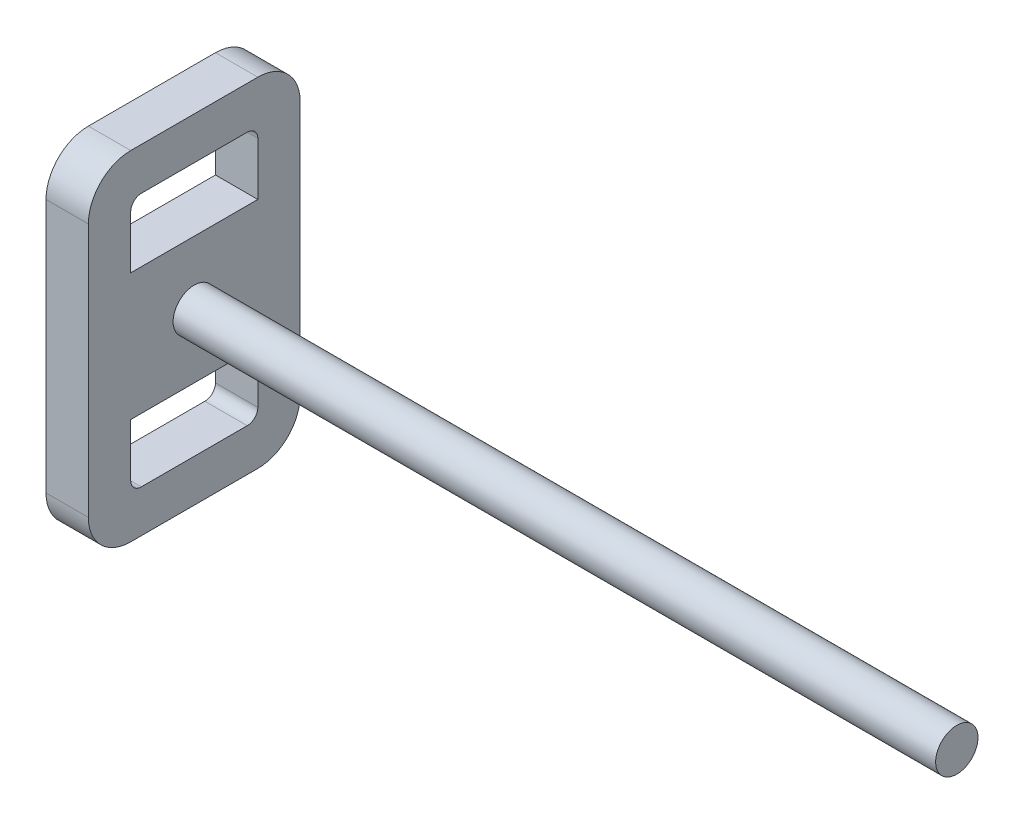
ISO-10303-21;
HEADER;
FILE_DESCRIPTION(('STEP AP214'),'2;1');
FILE_NAME('part.step','',(''),(''),'','','');
FILE_SCHEMA(('AUTOMOTIVE_DESIGN { 1 0 10303 214 1 1 1 1 }'));
ENDSEC;
DATA;
#1=APPLICATION_CONTEXT('core data for automotive mechanical design processes');
#2=APPLICATION_PROTOCOL_DEFINITION('international standard','automotive_design',2000,#1);
#3=PRODUCT_CONTEXT('',#1,'mechanical');
#4=PRODUCT('Part','Part','',(#3));
#5=PRODUCT_RELATED_PRODUCT_CATEGORY('part','',(#4));
#6=PRODUCT_DEFINITION_FORMATION('','',#4);
#7=PRODUCT_DEFINITION_CONTEXT('part definition',#1,'design');
#8=PRODUCT_DEFINITION('design','',#6,#7);
#9=PRODUCT_DEFINITION_SHAPE('','',#8);
#10=(LENGTH_UNIT() NAMED_UNIT(*) SI_UNIT(.MILLI.,.METRE.));
#11=(NAMED_UNIT(*) PLANE_ANGLE_UNIT() SI_UNIT($,.RADIAN.));
#12=(NAMED_UNIT(*) SI_UNIT($,.STERADIAN.) SOLID_ANGLE_UNIT());
#13=UNCERTAINTY_MEASURE_WITH_UNIT(LENGTH_MEASURE(1.E-05),#10,'distance_accuracy_value','');
#14=(GEOMETRIC_REPRESENTATION_CONTEXT(3) GLOBAL_UNCERTAINTY_ASSIGNED_CONTEXT((#13)) GLOBAL_UNIT_ASSIGNED_CONTEXT((#10,
#11,#12)) REPRESENTATION_CONTEXT('',''));
#15=CARTESIAN_POINT('',(0.,0.,0.));
#16=DIRECTION('',(0.,0.,1.));
#17=DIRECTION('',(1.,0.,0.));
#18=AXIS2_PLACEMENT_3D('',#15,#16,#17);
#19=CARTESIAN_POINT('',(457.2,0.,0.));
#20=DIRECTION('',(-1.,0.,0.));
#21=DIRECTION('',(0.,0.,1.));
#22=AXIS2_PLACEMENT_3D('',#19,#20,#21);
#23=CYLINDRICAL_SURFACE('',#22,12.7);
#24=CARTESIAN_POINT('',(457.2,0.,0.));
#25=DIRECTION('',(1.,0.,0.));
#26=DIRECTION('',(0.,0.,-1.));
#27=AXIS2_PLACEMENT_3D('',#24,#25,#26);
#28=CIRCLE('',#27,12.7);
#29=CARTESIAN_POINT('',(457.2,0.,-12.7));
#30=VERTEX_POINT('',#29);
#31=EDGE_CURVE('E11',#30,#30,#28,.T.);
#32=ORIENTED_EDGE('',*,*,#31,.F.);
#33=EDGE_LOOP('',(#32));
#34=FACE_BOUND('',#33,.T.);
#35=CARTESIAN_POINT('',(0.,0.,0.));
#36=DIRECTION('',(1.,0.,0.));
#37=DIRECTION('',(0.,0.,-1.));
#38=AXIS2_PLACEMENT_3D('',#35,#36,#37);
#39=CIRCLE('',#38,12.7);
#40=CARTESIAN_POINT('',(0.,0.,-12.7));
#41=VERTEX_POINT('',#40);
#42=EDGE_CURVE('E47',#41,#41,#39,.T.);
#43=ORIENTED_EDGE('',*,*,#42,.T.);
#44=EDGE_LOOP('',(#43));
#45=FACE_BOUND('',#44,.T.);
#46=ADVANCED_FACE('F39',(#34,#45),#23,.T.);
#47=CARTESIAN_POINT('',(457.2,0.,0.));
#48=DIRECTION('',(1.,0.,0.));
#49=DIRECTION('',(0.,0.,-1.));
#50=AXIS2_PLACEMENT_3D('',#47,#48,#49);
#51=PLANE('',#50);
#52=ORIENTED_EDGE('',*,*,#31,.T.);
#53=EDGE_LOOP('',(#52));
#54=FACE_BOUND('',#53,.T.);
#55=ADVANCED_FACE('F444',(#54),#51,.T.);
#56=CARTESIAN_POINT('',(-25.4,76.2,-38.1));
#57=DIRECTION('',(1.,0.,0.));
#58=DIRECTION('',(0.,0.,-1.));
#59=AXIS2_PLACEMENT_3D('',#56,#57,#58);
#60=PLANE('',#59);
#61=DIRECTION('',(0.,-1.,0.));
#62=VECTOR('',#61,1.);
#63=CARTESIAN_POINT('',(-25.4,69.85,-38.1));
#64=LINE('',#63,#62);
#65=CARTESIAN_POINT('',(-25.4,69.85,-38.1));
#66=VERTEX_POINT('',#65);
#67=CARTESIAN_POINT('',(-25.4,38.1,-38.1));
#68=VERTEX_POINT('',#67);
#69=EDGE_CURVE('E249',#66,#68,#64,.T.);
#70=ORIENTED_EDGE('',*,*,#69,.F.);
#71=CARTESIAN_POINT('',(-25.4,69.85,-31.75));
#72=DIRECTION('',(-1.,0.,0.));
#73=DIRECTION('',(0.,0.,-1.));
#74=AXIS2_PLACEMENT_3D('',#71,#72,#73);
#75=CIRCLE('',#74,6.34999999999999);
#76=CARTESIAN_POINT('',(-25.4,76.2,-31.75));
#77=VERTEX_POINT('',#76);
#78=EDGE_CURVE('E266',#77,#66,#75,.T.);
#79=ORIENTED_EDGE('',*,*,#78,.F.);
#80=DIRECTION('',(0.,0.,-1.));
#81=VECTOR('',#80,1.);
#82=CARTESIAN_POINT('',(-25.4,76.2,31.75));
#83=LINE('',#82,#81);
#84=CARTESIAN_POINT('',(-25.4,76.2,31.75));
#85=VERTEX_POINT('',#84);
#86=EDGE_CURVE('E262',#85,#77,#83,.T.);
#87=ORIENTED_EDGE('',*,*,#86,.F.);
#88=CARTESIAN_POINT('',(-25.4,69.85,31.75));
#89=DIRECTION('',(-1.,0.,0.));
#90=DIRECTION('',(0.,0.,1.));
#91=AXIS2_PLACEMENT_3D('',#88,#89,#90);
#92=CIRCLE('',#91,6.35);
#93=CARTESIAN_POINT('',(-25.4,69.85,38.1));
#94=VERTEX_POINT('',#93);
#95=EDGE_CURVE('E259',#94,#85,#92,.T.);
#96=ORIENTED_EDGE('',*,*,#95,.F.);
#97=DIRECTION('',(0.,1.,0.));
#98=VECTOR('',#97,1.);
#99=CARTESIAN_POINT('',(-25.4,69.85,38.1));
#100=LINE('',#99,#98);
#101=CARTESIAN_POINT('',(-25.4,38.1,38.1));
#102=VERTEX_POINT('',#101);
#103=EDGE_CURVE('E256',#102,#94,#100,.T.);
#104=ORIENTED_EDGE('',*,*,#103,.F.);
#105=DIRECTION('',(0.,0.,1.));
#106=VECTOR('',#105,1.);
#107=CARTESIAN_POINT('',(-25.4,38.1,38.1));
#108=LINE('',#107,#106);
#109=EDGE_CURVE('E252',#68,#102,#108,.T.);
#110=ORIENTED_EDGE('',*,*,#109,.F.);
#111=EDGE_LOOP('',(#70,#79,#87,#96,#104,#110));
#112=FACE_BOUND('',#111,.T.);
#113=CARTESIAN_POINT('',(-25.4,76.2,-38.1));
#114=DIRECTION('',(-1.,0.,0.));
#115=DIRECTION('',(0.,0.,-1.));
#116=AXIS2_PLACEMENT_3D('',#113,#114,#115);
#117=CIRCLE('',#116,25.4);
#118=CARTESIAN_POINT('',(-25.4,101.6,-38.0999999999998));
#119=VERTEX_POINT('',#118);
#120=CARTESIAN_POINT('',(-25.4,76.1999999999998,-63.5));
#121=VERTEX_POINT('',#120);
#122=EDGE_CURVE('E312',#119,#121,#117,.T.);
#123=ORIENTED_EDGE('',*,*,#122,.T.);
#124=DIRECTION('',(0.,-1.,0.));
#125=VECTOR('',#124,1.);
#126=CARTESIAN_POINT('',(-25.4,-76.1999999999998,-63.5));
#127=LINE('',#126,#125);
#128=CARTESIAN_POINT('',(-25.4,-76.1999999999998,-63.5));
#129=VERTEX_POINT('',#128);
#130=EDGE_CURVE('E316',#121,#129,#127,.T.);
#131=ORIENTED_EDGE('',*,*,#130,.T.);
#132=CARTESIAN_POINT('',(-25.4,-76.2,-38.1));
#133=DIRECTION('',(-1.,0.,0.));
#134=DIRECTION('',(0.,0.,-1.));
#135=AXIS2_PLACEMENT_3D('',#132,#133,#134);
#136=CIRCLE('',#135,25.4);
#137=CARTESIAN_POINT('',(-25.4,-101.6,-38.0999999999998));
#138=VERTEX_POINT('',#137);
#139=EDGE_CURVE('E320',#129,#138,#136,.T.);
#140=ORIENTED_EDGE('',*,*,#139,.T.);
#141=DIRECTION('',(0.,0.,1.));
#142=VECTOR('',#141,1.);
#143=CARTESIAN_POINT('',(-25.4,-101.6,-38.0999999999998));
#144=LINE('',#143,#142);
#145=CARTESIAN_POINT('',(-25.4,-101.6,38.0999999999998));
#146=VERTEX_POINT('',#145);
#147=EDGE_CURVE('E323',#138,#146,#144,.T.);
#148=ORIENTED_EDGE('',*,*,#147,.T.);
#149=CARTESIAN_POINT('',(-25.4,-76.2,38.1));
#150=DIRECTION('',(-1.,0.,0.));
#151=DIRECTION('',(0.,0.,1.));
#152=AXIS2_PLACEMENT_3D('',#149,#150,#151);
#153=CIRCLE('',#152,25.4);
#154=CARTESIAN_POINT('',(-25.4,-76.2,63.5));
#155=VERTEX_POINT('',#154);
#156=EDGE_CURVE('E326',#146,#155,#153,.T.);
#157=ORIENTED_EDGE('',*,*,#156,.T.);
#158=DIRECTION('',(0.,1.,0.));
#159=VECTOR('',#158,1.);
#160=CARTESIAN_POINT('',(-25.4,-76.1999999999998,63.5));
#161=LINE('',#160,#159);
#162=CARTESIAN_POINT('',(-25.4,76.1999999999998,63.5));
#163=VERTEX_POINT('',#162);
#164=EDGE_CURVE('E329',#155,#163,#161,.T.);
#165=ORIENTED_EDGE('',*,*,#164,.T.);
#166=CARTESIAN_POINT('',(-25.4,76.2,38.1));
#167=DIRECTION('',(-1.,0.,0.));
#168=DIRECTION('',(0.,0.,1.));
#169=AXIS2_PLACEMENT_3D('',#166,#167,#168);
#170=CIRCLE('',#169,25.4);
#171=CARTESIAN_POINT('',(-25.4,101.6,38.0999999999998));
#172=VERTEX_POINT('',#171);
#173=EDGE_CURVE('E332',#163,#172,#170,.T.);
#174=ORIENTED_EDGE('',*,*,#173,.T.);
#175=DIRECTION('',(0.,0.,-1.));
#176=VECTOR('',#175,1.);
#177=CARTESIAN_POINT('',(-25.4,101.6,-38.0999999999998));
#178=LINE('',#177,#176);
#179=EDGE_CURVE('E335',#172,#119,#178,.T.);
#180=ORIENTED_EDGE('',*,*,#179,.T.);
#181=EDGE_LOOP('',(#123,#131,#140,#148,#157,#165,#174,#180));
#182=FACE_BOUND('',#181,.T.);
#183=DIRECTION('',(0.,-1.,0.));
#184=VECTOR('',#183,1.);
#185=CARTESIAN_POINT('',(-25.4,-69.85,-38.1));
#186=LINE('',#185,#184);
#187=CARTESIAN_POINT('',(-25.4,-38.1,-38.1));
#188=VERTEX_POINT('',#187);
#189=CARTESIAN_POINT('',(-25.4,-69.85,-38.1));
#190=VERTEX_POINT('',#189);
#191=EDGE_CURVE('E176',#188,#190,#186,.T.);
#192=ORIENTED_EDGE('',*,*,#191,.F.);
#193=DIRECTION('',(0.,0.,-1.));
#194=VECTOR('',#193,1.);
#195=CARTESIAN_POINT('',(-25.4,-38.1,38.1));
#196=LINE('',#195,#194);
#197=CARTESIAN_POINT('',(-25.4,-38.1,38.1));
#198=VERTEX_POINT('',#197);
#199=EDGE_CURVE('E214',#198,#188,#196,.T.);
#200=ORIENTED_EDGE('',*,*,#199,.F.);
#201=DIRECTION('',(0.,1.,0.));
#202=VECTOR('',#201,1.);
#203=CARTESIAN_POINT('',(-25.4,-69.85,38.1));
#204=LINE('',#203,#202);
#205=CARTESIAN_POINT('',(-25.4,-69.85,38.1));
#206=VERTEX_POINT('',#205);
#207=EDGE_CURVE('E211',#206,#198,#204,.T.);
#208=ORIENTED_EDGE('',*,*,#207,.F.);
#209=CARTESIAN_POINT('',(-25.4,-69.85,31.75));
#210=DIRECTION('',(-1.,0.,0.));
#211=DIRECTION('',(0.,0.,1.));
#212=AXIS2_PLACEMENT_3D('',#209,#210,#211);
#213=CIRCLE('',#212,6.34999999999999);
#214=CARTESIAN_POINT('',(-25.4,-76.2,31.75));
#215=VERTEX_POINT('',#214);
#216=EDGE_CURVE('E205',#215,#206,#213,.T.);
#217=ORIENTED_EDGE('',*,*,#216,.F.);
#218=DIRECTION('',(0.,0.,1.));
#219=VECTOR('',#218,1.);
#220=CARTESIAN_POINT('',(-25.4,-76.2,31.75));
#221=LINE('',#220,#219);
#222=CARTESIAN_POINT('',(-25.4,-76.2,-31.75));
#223=VERTEX_POINT('',#222);
#224=EDGE_CURVE('E201',#223,#215,#221,.T.);
#225=ORIENTED_EDGE('',*,*,#224,.F.);
#226=CARTESIAN_POINT('',(-25.4,-69.85,-31.75));
#227=DIRECTION('',(-1.,0.,0.));
#228=DIRECTION('',(0.,0.,-1.));
#229=AXIS2_PLACEMENT_3D('',#226,#227,#228);
#230=CIRCLE('',#229,6.34999999999999);
#231=EDGE_CURVE('E185',#190,#223,#230,.T.);
#232=ORIENTED_EDGE('',*,*,#231,.F.);
#233=EDGE_LOOP('',(#192,#200,#208,#217,#225,#232));
#234=FACE_BOUND('',#233,.T.);
#235=CARTESIAN_POINT('',(-25.4,0.,0.));
#236=DIRECTION('',(-1.,0.,0.));
#237=DIRECTION('',(0.,0.,1.));
#238=AXIS2_PLACEMENT_3D('',#235,#236,#237);
#239=CIRCLE('',#238,3.175);
#240=CARTESIAN_POINT('',(-25.4,0.,3.175));
#241=VERTEX_POINT('',#240);
#242=EDGE_CURVE('E219',#241,#241,#239,.T.);
#243=ORIENTED_EDGE('',*,*,#242,.F.);
#244=EDGE_LOOP('',(#243));
#245=FACE_BOUND('',#244,.T.);
#246=ADVANCED_FACE('F198',(#112,#182,#234,#245),#60,.F.);
#247=CARTESIAN_POINT('',(0.,76.2,-38.1));
#248=DIRECTION('',(1.,0.,0.));
#249=DIRECTION('',(0.,0.,-1.));
#250=AXIS2_PLACEMENT_3D('',#247,#248,#249);
#251=PLANE('',#250);
#252=ORIENTED_EDGE('',*,*,#42,.F.);
#253=EDGE_LOOP('',(#252));
#254=FACE_BOUND('',#253,.T.);
#255=DIRECTION('',(0.,0.,-1.));
#256=VECTOR('',#255,1.);
#257=CARTESIAN_POINT('',(0.,-38.1,38.1));
#258=LINE('',#257,#256);
#259=CARTESIAN_POINT('',(0.,-38.1,38.1));
#260=VERTEX_POINT('',#259);
#261=CARTESIAN_POINT('',(0.,-38.1,-38.1));
#262=VERTEX_POINT('',#261);
#263=EDGE_CURVE('E186',#260,#262,#258,.T.);
#264=ORIENTED_EDGE('',*,*,#263,.T.);
#265=DIRECTION('',(0.,-1.,0.));
#266=VECTOR('',#265,1.);
#267=CARTESIAN_POINT('',(0.,-69.85,-38.1));
#268=LINE('',#267,#266);
#269=CARTESIAN_POINT('',(0.,-69.85,-38.1));
#270=VERTEX_POINT('',#269);
#271=EDGE_CURVE('E62',#262,#270,#268,.T.);
#272=ORIENTED_EDGE('',*,*,#271,.T.);
#273=CARTESIAN_POINT('',(0.,-69.85,-31.75));
#274=DIRECTION('',(-1.,0.,0.));
#275=DIRECTION('',(0.,0.,-1.));
#276=AXIS2_PLACEMENT_3D('',#273,#274,#275);
#277=CIRCLE('',#276,6.34999999999999);
#278=CARTESIAN_POINT('',(0.,-76.2,-31.75));
#279=VERTEX_POINT('',#278);
#280=EDGE_CURVE('E192',#270,#279,#277,.T.);
#281=ORIENTED_EDGE('',*,*,#280,.T.);
#282=DIRECTION('',(0.,0.,1.));
#283=VECTOR('',#282,1.);
#284=CARTESIAN_POINT('',(0.,-76.2,31.75));
#285=LINE('',#284,#283);
#286=CARTESIAN_POINT('',(0.,-76.2,31.75));
#287=VERTEX_POINT('',#286);
#288=EDGE_CURVE('E222',#279,#287,#285,.T.);
#289=ORIENTED_EDGE('',*,*,#288,.T.);
#290=CARTESIAN_POINT('',(0.,-69.85,31.75));
#291=DIRECTION('',(-1.,0.,0.));
#292=DIRECTION('',(0.,0.,1.));
#293=AXIS2_PLACEMENT_3D('',#290,#291,#292);
#294=CIRCLE('',#293,6.34999999999999);
#295=CARTESIAN_POINT('',(0.,-69.85,38.1));
#296=VERTEX_POINT('',#295);
#297=EDGE_CURVE('E226',#287,#296,#294,.T.);
#298=ORIENTED_EDGE('',*,*,#297,.T.);
#299=DIRECTION('',(0.,1.,0.));
#300=VECTOR('',#299,1.);
#301=CARTESIAN_POINT('',(0.,-69.85,38.1));
#302=LINE('',#301,#300);
#303=EDGE_CURVE('E230',#296,#260,#302,.T.);
#304=ORIENTED_EDGE('',*,*,#303,.T.);
#305=EDGE_LOOP('',(#264,#272,#281,#289,#298,#304));
#306=FACE_BOUND('',#305,.T.);
#307=CARTESIAN_POINT('',(0.,69.85,-31.75));
#308=DIRECTION('',(-1.,0.,0.));
#309=DIRECTION('',(0.,0.,-1.));
#310=AXIS2_PLACEMENT_3D('',#307,#308,#309);
#311=CIRCLE('',#310,6.34999999999999);
#312=CARTESIAN_POINT('',(0.,76.2,-31.75));
#313=VERTEX_POINT('',#312);
#314=CARTESIAN_POINT('',(0.,69.85,-38.1));
#315=VERTEX_POINT('',#314);
#316=EDGE_CURVE('E253',#313,#315,#311,.T.);
#317=ORIENTED_EDGE('',*,*,#316,.T.);
#318=DIRECTION('',(0.,-1.,0.));
#319=VECTOR('',#318,1.);
#320=CARTESIAN_POINT('',(0.,69.85,-38.1));
#321=LINE('',#320,#319);
#322=CARTESIAN_POINT('',(0.,38.1,-38.1));
#323=VERTEX_POINT('',#322);
#324=EDGE_CURVE('E194',#315,#323,#321,.T.);
#325=ORIENTED_EDGE('',*,*,#324,.T.);
#326=DIRECTION('',(0.,0.,1.));
#327=VECTOR('',#326,1.);
#328=CARTESIAN_POINT('',(0.,38.1,38.1));
#329=LINE('',#328,#327);
#330=CARTESIAN_POINT('',(0.,38.1,38.1));
#331=VERTEX_POINT('',#330);
#332=EDGE_CURVE('E273',#323,#331,#329,.T.);
#333=ORIENTED_EDGE('',*,*,#332,.T.);
#334=DIRECTION('',(0.,1.,0.));
#335=VECTOR('',#334,1.);
#336=CARTESIAN_POINT('',(0.,69.85,38.1));
#337=LINE('',#336,#335);
#338=CARTESIAN_POINT('',(0.,69.85,38.1));
#339=VERTEX_POINT('',#338);
#340=EDGE_CURVE('E277',#331,#339,#337,.T.);
#341=ORIENTED_EDGE('',*,*,#340,.T.);
#342=CARTESIAN_POINT('',(0.,69.85,31.75));
#343=DIRECTION('',(-1.,0.,0.));
#344=DIRECTION('',(0.,0.,1.));
#345=AXIS2_PLACEMENT_3D('',#342,#343,#344);
#346=CIRCLE('',#345,6.35);
#347=CARTESIAN_POINT('',(0.,76.2,31.75));
#348=VERTEX_POINT('',#347);
#349=EDGE_CURVE('E281',#339,#348,#346,.T.);
#350=ORIENTED_EDGE('',*,*,#349,.T.);
#351=DIRECTION('',(0.,0.,-1.));
#352=VECTOR('',#351,1.);
#353=CARTESIAN_POINT('',(0.,76.2,31.75));
#354=LINE('',#353,#352);
#355=EDGE_CURVE('E285',#348,#313,#354,.T.);
#356=ORIENTED_EDGE('',*,*,#355,.T.);
#357=EDGE_LOOP('',(#317,#325,#333,#341,#350,#356));
#358=FACE_BOUND('',#357,.T.);
#359=CARTESIAN_POINT('',(0.,76.2,-38.1));
#360=DIRECTION('',(-1.,0.,0.));
#361=DIRECTION('',(0.,0.,-1.));
#362=AXIS2_PLACEMENT_3D('',#359,#360,#361);
#363=CIRCLE('',#362,25.4);
#364=CARTESIAN_POINT('',(0.,101.6,-38.0999999999998));
#365=VERTEX_POINT('',#364);
#366=CARTESIAN_POINT('',(0.,76.1999999999998,-63.5));
#367=VERTEX_POINT('',#366);
#368=EDGE_CURVE('E311',#365,#367,#363,.T.);
#369=ORIENTED_EDGE('',*,*,#368,.F.);
#370=DIRECTION('',(0.,0.,-1.));
#371=VECTOR('',#370,1.);
#372=CARTESIAN_POINT('',(0.,101.6,-38.0999999999998));
#373=LINE('',#372,#371);
#374=CARTESIAN_POINT('',(0.,101.6,38.0999999999998));
#375=VERTEX_POINT('',#374);
#376=EDGE_CURVE('E317',#375,#365,#373,.T.);
#377=ORIENTED_EDGE('',*,*,#376,.F.);
#378=CARTESIAN_POINT('',(0.,76.2,38.1));
#379=DIRECTION('',(-1.,0.,0.));
#380=DIRECTION('',(0.,0.,1.));
#381=AXIS2_PLACEMENT_3D('',#378,#379,#380);
#382=CIRCLE('',#381,25.4);
#383=CARTESIAN_POINT('',(0.,76.1999999999998,63.5));
#384=VERTEX_POINT('',#383);
#385=EDGE_CURVE('E357',#384,#375,#382,.T.);
#386=ORIENTED_EDGE('',*,*,#385,.F.);
#387=DIRECTION('',(0.,1.,0.));
#388=VECTOR('',#387,1.);
#389=CARTESIAN_POINT('',(0.,-76.1999999999998,63.5));
#390=LINE('',#389,#388);
#391=CARTESIAN_POINT('',(0.,-76.2,63.5));
#392=VERTEX_POINT('',#391);
#393=EDGE_CURVE('E354',#392,#384,#390,.T.);
#394=ORIENTED_EDGE('',*,*,#393,.F.);
#395=CARTESIAN_POINT('',(0.,-76.2,38.1));
#396=DIRECTION('',(-1.,0.,0.));
#397=DIRECTION('',(0.,0.,1.));
#398=AXIS2_PLACEMENT_3D('',#395,#396,#397);
#399=CIRCLE('',#398,25.4);
#400=CARTESIAN_POINT('',(0.,-101.6,38.0999999999998));
#401=VERTEX_POINT('',#400);
#402=EDGE_CURVE('E351',#401,#392,#399,.T.);
#403=ORIENTED_EDGE('',*,*,#402,.F.);
#404=DIRECTION('',(0.,0.,1.));
#405=VECTOR('',#404,1.);
#406=CARTESIAN_POINT('',(0.,-101.6,-38.0999999999998));
#407=LINE('',#406,#405);
#408=CARTESIAN_POINT('',(0.,-101.6,-38.0999999999998));
#409=VERTEX_POINT('',#408);
#410=EDGE_CURVE('E348',#409,#401,#407,.T.);
#411=ORIENTED_EDGE('',*,*,#410,.F.);
#412=CARTESIAN_POINT('',(0.,-76.2,-38.1));
#413=DIRECTION('',(-1.,0.,0.));
#414=DIRECTION('',(0.,0.,-1.));
#415=AXIS2_PLACEMENT_3D('',#412,#413,#414);
#416=CIRCLE('',#415,25.4);
#417=CARTESIAN_POINT('',(0.,-76.1999999999998,-63.5));
#418=VERTEX_POINT('',#417);
#419=EDGE_CURVE('E345',#418,#409,#416,.T.);
#420=ORIENTED_EDGE('',*,*,#419,.F.);
#421=DIRECTION('',(0.,-1.,0.));
#422=VECTOR('',#421,1.);
#423=CARTESIAN_POINT('',(0.,-76.1999999999998,-63.5));
#424=LINE('',#423,#422);
#425=EDGE_CURVE('E342',#367,#418,#424,.T.);
#426=ORIENTED_EDGE('',*,*,#425,.F.);
#427=EDGE_LOOP('',(#369,#377,#386,#394,#403,#411,#420,#426));
#428=FACE_BOUND('',#427,.T.);
#429=ADVANCED_FACE('F397',(#254,#306,#358,#428),#251,.T.);
#430=CARTESIAN_POINT('',(-25.4,76.2,-38.1));
#431=DIRECTION('',(1.,0.,0.));
#432=DIRECTION('',(0.,0.,-1.));
#433=AXIS2_PLACEMENT_3D('',#430,#431,#432);
#434=CYLINDRICAL_SURFACE('',#433,25.4);
#435=ORIENTED_EDGE('',*,*,#368,.T.);
#436=DIRECTION('',(1.,0.,0.));
#437=VECTOR('',#436,1.);
#438=CARTESIAN_POINT('',(-25.4,76.1999999999998,-63.5));
#439=LINE('',#438,#437);
#440=EDGE_CURVE('E389',#121,#367,#439,.T.);
#441=ORIENTED_EDGE('',*,*,#440,.F.);
#442=ORIENTED_EDGE('',*,*,#122,.F.);
#443=DIRECTION('',(1.,0.,0.));
#444=VECTOR('',#443,1.);
#445=CARTESIAN_POINT('',(-25.4,101.6,-38.0999999999998));
#446=LINE('',#445,#444);
#447=EDGE_CURVE('E338',#119,#365,#446,.T.);
#448=ORIENTED_EDGE('',*,*,#447,.T.);
#449=EDGE_LOOP('',(#435,#441,#442,#448));
#450=FACE_BOUND('',#449,.T.);
#451=ADVANCED_FACE('F400',(#450),#434,.T.);
#452=CARTESIAN_POINT('',(-25.4,-76.1999999999998,-63.5));
#453=DIRECTION('',(0.,0.,1.));
#454=DIRECTION('',(1.,0.,0.));
#455=AXIS2_PLACEMENT_3D('',#452,#453,#454);
#456=PLANE('',#455);
#457=ORIENTED_EDGE('',*,*,#425,.T.);
#458=DIRECTION('',(1.,0.,0.));
#459=VECTOR('',#458,1.);
#460=CARTESIAN_POINT('',(-25.4,-76.1999999999998,-63.5));
#461=LINE('',#460,#459);
#462=EDGE_CURVE('E385',#129,#418,#461,.T.);
#463=ORIENTED_EDGE('',*,*,#462,.F.);
#464=ORIENTED_EDGE('',*,*,#130,.F.);
#465=ORIENTED_EDGE('',*,*,#440,.T.);
#466=EDGE_LOOP('',(#457,#463,#464,#465));
#467=FACE_BOUND('',#466,.T.);
#468=ADVANCED_FACE('F441',(#467),#456,.F.);
#469=CARTESIAN_POINT('',(-25.4,-76.2,-38.1));
#470=DIRECTION('',(1.,0.,0.));
#471=DIRECTION('',(0.,0.,-1.));
#472=AXIS2_PLACEMENT_3D('',#469,#470,#471);
#473=CYLINDRICAL_SURFACE('',#472,25.4);
#474=ORIENTED_EDGE('',*,*,#419,.T.);
#475=DIRECTION('',(1.,0.,0.));
#476=VECTOR('',#475,1.);
#477=CARTESIAN_POINT('',(-25.4,-101.6,-38.0999999999998));
#478=LINE('',#477,#476);
#479=EDGE_CURVE('E381',#138,#409,#478,.T.);
#480=ORIENTED_EDGE('',*,*,#479,.F.);
#481=ORIENTED_EDGE('',*,*,#139,.F.);
#482=ORIENTED_EDGE('',*,*,#462,.T.);
#483=EDGE_LOOP('',(#474,#480,#481,#482));
#484=FACE_BOUND('',#483,.T.);
#485=ADVANCED_FACE('F437',(#484),#473,.T.);
#486=CARTESIAN_POINT('',(-25.4,-101.6,-38.0999999999998));
#487=DIRECTION('',(0.,1.,0.));
#488=DIRECTION('',(0.,0.,1.));
#489=AXIS2_PLACEMENT_3D('',#486,#487,#488);
#490=PLANE('',#489);
#491=ORIENTED_EDGE('',*,*,#410,.T.);
#492=DIRECTION('',(1.,0.,0.));
#493=VECTOR('',#492,1.);
#494=CARTESIAN_POINT('',(-25.4,-101.6,38.0999999999998));
#495=LINE('',#494,#493);
#496=EDGE_CURVE('E377',#146,#401,#495,.T.);
#497=ORIENTED_EDGE('',*,*,#496,.F.);
#498=ORIENTED_EDGE('',*,*,#147,.F.);
#499=ORIENTED_EDGE('',*,*,#479,.T.);
#500=EDGE_LOOP('',(#491,#497,#498,#499));
#501=FACE_BOUND('',#500,.T.);
#502=ADVANCED_FACE('F434',(#501),#490,.F.);
#503=CARTESIAN_POINT('',(-25.4,-76.2,38.1));
#504=DIRECTION('',(1.,0.,0.));
#505=DIRECTION('',(0.,0.,-1.));
#506=AXIS2_PLACEMENT_3D('',#503,#504,#505);
#507=CYLINDRICAL_SURFACE('',#506,25.4);
#508=ORIENTED_EDGE('',*,*,#402,.T.);
#509=DIRECTION('',(1.,0.,0.));
#510=VECTOR('',#509,1.);
#511=CARTESIAN_POINT('',(-25.4,-76.2,63.5));
#512=LINE('',#511,#510);
#513=EDGE_CURVE('E373',#155,#392,#512,.T.);
#514=ORIENTED_EDGE('',*,*,#513,.F.);
#515=ORIENTED_EDGE('',*,*,#156,.F.);
#516=ORIENTED_EDGE('',*,*,#496,.T.);
#517=EDGE_LOOP('',(#508,#514,#515,#516));
#518=FACE_BOUND('',#517,.T.);
#519=ADVANCED_FACE('F430',(#518),#507,.T.);
#520=CARTESIAN_POINT('',(-25.4,-76.1999999999998,63.5));
#521=DIRECTION('',(0.,0.,-1.));
#522=DIRECTION('',(-1.,0.,0.));
#523=AXIS2_PLACEMENT_3D('',#520,#521,#522);
#524=PLANE('',#523);
#525=ORIENTED_EDGE('',*,*,#393,.T.);
#526=DIRECTION('',(1.,0.,0.));
#527=VECTOR('',#526,1.);
#528=CARTESIAN_POINT('',(-25.4,76.1999999999998,63.5));
#529=LINE('',#528,#527);
#530=EDGE_CURVE('E369',#163,#384,#529,.T.);
#531=ORIENTED_EDGE('',*,*,#530,.F.);
#532=ORIENTED_EDGE('',*,*,#164,.F.);
#533=ORIENTED_EDGE('',*,*,#513,.T.);
#534=EDGE_LOOP('',(#525,#531,#532,#533));
#535=FACE_BOUND('',#534,.T.);
#536=ADVANCED_FACE('F425',(#535),#524,.F.);
#537=CARTESIAN_POINT('',(-25.4,76.2,38.1));
#538=DIRECTION('',(1.,0.,0.));
#539=DIRECTION('',(0.,0.,-1.));
#540=AXIS2_PLACEMENT_3D('',#537,#538,#539);
#541=CYLINDRICAL_SURFACE('',#540,25.4);
#542=ORIENTED_EDGE('',*,*,#385,.T.);
#543=DIRECTION('',(1.,0.,0.));
#544=VECTOR('',#543,1.);
#545=CARTESIAN_POINT('',(-25.4,101.6,38.0999999999998));
#546=LINE('',#545,#544);
#547=EDGE_CURVE('E365',#172,#375,#546,.T.);
#548=ORIENTED_EDGE('',*,*,#547,.F.);
#549=ORIENTED_EDGE('',*,*,#173,.F.);
#550=ORIENTED_EDGE('',*,*,#530,.T.);
#551=EDGE_LOOP('',(#542,#548,#549,#550));
#552=FACE_BOUND('',#551,.T.);
#553=ADVANCED_FACE('F419',(#552),#541,.T.);
#554=CARTESIAN_POINT('',(-25.4,101.6,-38.0999999999998));
#555=DIRECTION('',(0.,-1.,0.));
#556=DIRECTION('',(0.,0.,-1.));
#557=AXIS2_PLACEMENT_3D('',#554,#555,#556);
#558=PLANE('',#557);
#559=ORIENTED_EDGE('',*,*,#376,.T.);
#560=ORIENTED_EDGE('',*,*,#447,.F.);
#561=ORIENTED_EDGE('',*,*,#179,.F.);
#562=ORIENTED_EDGE('',*,*,#547,.T.);
#563=EDGE_LOOP('',(#559,#560,#561,#562));
#564=FACE_BOUND('',#563,.T.);
#565=ADVANCED_FACE('F415',(#564),#558,.F.);
#566=CARTESIAN_POINT('',(-25.4,69.85,-38.1));
#567=DIRECTION('',(0.,0.,1.));
#568=DIRECTION('',(1.,0.,0.));
#569=AXIS2_PLACEMENT_3D('',#566,#567,#568);
#570=PLANE('',#569);
#571=ORIENTED_EDGE('',*,*,#324,.F.);
#572=DIRECTION('',(1.,0.,0.));
#573=VECTOR('',#572,1.);
#574=CARTESIAN_POINT('',(-25.4,69.85,-38.1));
#575=LINE('',#574,#573);
#576=EDGE_CURVE('E269',#66,#315,#575,.T.);
#577=ORIENTED_EDGE('',*,*,#576,.F.);
#578=ORIENTED_EDGE('',*,*,#69,.T.);
#579=DIRECTION('',(1.,0.,0.));
#580=VECTOR('',#579,1.);
#581=CARTESIAN_POINT('',(-25.4,38.1,-38.1));
#582=LINE('',#581,#580);
#583=EDGE_CURVE('E307',#68,#323,#582,.T.);
#584=ORIENTED_EDGE('',*,*,#583,.T.);
#585=EDGE_LOOP('',(#571,#577,#578,#584));
#586=FACE_BOUND('',#585,.T.);
#587=ADVANCED_FACE('F537',(#586),#570,.T.);
#588=CARTESIAN_POINT('',(-25.4,38.1,38.1));
#589=DIRECTION('',(0.,1.,0.));
#590=DIRECTION('',(0.,0.,1.));
#591=AXIS2_PLACEMENT_3D('',#588,#589,#590);
#592=PLANE('',#591);
#593=ORIENTED_EDGE('',*,*,#332,.F.);
#594=ORIENTED_EDGE('',*,*,#583,.F.);
#595=ORIENTED_EDGE('',*,*,#109,.T.);
#596=DIRECTION('',(1.,0.,0.));
#597=VECTOR('',#596,1.);
#598=CARTESIAN_POINT('',(-25.4,38.1,38.1));
#599=LINE('',#598,#597);
#600=EDGE_CURVE('E304',#102,#331,#599,.T.);
#601=ORIENTED_EDGE('',*,*,#600,.T.);
#602=EDGE_LOOP('',(#593,#594,#595,#601));
#603=FACE_BOUND('',#602,.T.);
#604=ADVANCED_FACE('F546',(#603),#592,.T.);
#605=CARTESIAN_POINT('',(-25.4,69.85,38.1));
#606=DIRECTION('',(0.,0.,-1.));
#607=DIRECTION('',(0.,1.,0.));
#608=AXIS2_PLACEMENT_3D('',#605,#606,#607);
#609=PLANE('',#608);
#610=ORIENTED_EDGE('',*,*,#340,.F.);
#611=ORIENTED_EDGE('',*,*,#600,.F.);
#612=ORIENTED_EDGE('',*,*,#103,.T.);
#613=DIRECTION('',(1.,0.,0.));
#614=VECTOR('',#613,1.);
#615=CARTESIAN_POINT('',(-25.4,69.85,38.1));
#616=LINE('',#615,#614);
#617=EDGE_CURVE('E301',#94,#339,#616,.T.);
#618=ORIENTED_EDGE('',*,*,#617,.T.);
#619=EDGE_LOOP('',(#610,#611,#612,#618));
#620=FACE_BOUND('',#619,.T.);
#621=ADVANCED_FACE('F555',(#620),#609,.T.);
#622=CARTESIAN_POINT('',(-25.4,69.85,31.75));
#623=DIRECTION('',(1.,0.,0.));
#624=DIRECTION('',(0.,0.,-1.));
#625=AXIS2_PLACEMENT_3D('',#622,#623,#624);
#626=CYLINDRICAL_SURFACE('',#625,6.35);
#627=ORIENTED_EDGE('',*,*,#349,.F.);
#628=ORIENTED_EDGE('',*,*,#617,.F.);
#629=ORIENTED_EDGE('',*,*,#95,.T.);
#630=DIRECTION('',(1.,0.,0.));
#631=VECTOR('',#630,1.);
#632=CARTESIAN_POINT('',(-25.4,76.2,31.75));
#633=LINE('',#632,#631);
#634=EDGE_CURVE('E298',#85,#348,#633,.T.);
#635=ORIENTED_EDGE('',*,*,#634,.T.);
#636=EDGE_LOOP('',(#627,#628,#629,#635));
#637=FACE_BOUND('',#636,.T.);
#638=ADVANCED_FACE('F565',(#637),#626,.F.);
#639=CARTESIAN_POINT('',(-25.4,76.2,31.75));
#640=DIRECTION('',(0.,-1.,0.));
#641=DIRECTION('',(0.,0.,-1.));
#642=AXIS2_PLACEMENT_3D('',#639,#640,#641);
#643=PLANE('',#642);
#644=ORIENTED_EDGE('',*,*,#355,.F.);
#645=ORIENTED_EDGE('',*,*,#634,.F.);
#646=ORIENTED_EDGE('',*,*,#86,.T.);
#647=DIRECTION('',(1.,0.,0.));
#648=VECTOR('',#647,1.);
#649=CARTESIAN_POINT('',(-25.4,76.2,-31.75));
#650=LINE('',#649,#648);
#651=EDGE_CURVE('E295',#77,#313,#650,.T.);
#652=ORIENTED_EDGE('',*,*,#651,.T.);
#653=EDGE_LOOP('',(#644,#645,#646,#652));
#654=FACE_BOUND('',#653,.T.);
#655=ADVANCED_FACE('F575',(#654),#643,.T.);
#656=CARTESIAN_POINT('',(-25.4,69.85,-31.75));
#657=DIRECTION('',(1.,0.,0.));
#658=DIRECTION('',(0.,0.,-1.));
#659=AXIS2_PLACEMENT_3D('',#656,#657,#658);
#660=CYLINDRICAL_SURFACE('',#659,6.34999999999999);
#661=ORIENTED_EDGE('',*,*,#316,.F.);
#662=ORIENTED_EDGE('',*,*,#651,.F.);
#663=ORIENTED_EDGE('',*,*,#78,.T.);
#664=ORIENTED_EDGE('',*,*,#576,.T.);
#665=EDGE_LOOP('',(#661,#662,#663,#664));
#666=FACE_BOUND('',#665,.T.);
#667=ADVANCED_FACE('F585',(#666),#660,.F.);
#668=CARTESIAN_POINT('',(-25.4,-69.85,-38.1));
#669=DIRECTION('',(0.,0.,1.));
#670=DIRECTION('',(1.,0.,0.));
#671=AXIS2_PLACEMENT_3D('',#668,#669,#670);
#672=PLANE('',#671);
#673=ORIENTED_EDGE('',*,*,#271,.F.);
#674=DIRECTION('',(1.,0.,0.));
#675=VECTOR('',#674,1.);
#676=CARTESIAN_POINT('',(-25.4,-38.1,-38.1));
#677=LINE('',#676,#675);
#678=EDGE_CURVE('E180',#188,#262,#677,.T.);
#679=ORIENTED_EDGE('',*,*,#678,.F.);
#680=ORIENTED_EDGE('',*,*,#191,.T.);
#681=DIRECTION('',(1.,0.,0.));
#682=VECTOR('',#681,1.);
#683=CARTESIAN_POINT('',(-25.4,-69.85,-38.1));
#684=LINE('',#683,#682);
#685=EDGE_CURVE('E179',#190,#270,#684,.T.);
#686=ORIENTED_EDGE('',*,*,#685,.T.);
#687=EDGE_LOOP('',(#673,#679,#680,#686));
#688=FACE_BOUND('',#687,.T.);
#689=ADVANCED_FACE('F178',(#688),#672,.T.);
#690=CARTESIAN_POINT('',(-25.4,-69.85,-31.75));
#691=DIRECTION('',(1.,0.,0.));
#692=DIRECTION('',(0.,0.,-1.));
#693=AXIS2_PLACEMENT_3D('',#690,#691,#692);
#694=CYLINDRICAL_SURFACE('',#693,6.34999999999999);
#695=ORIENTED_EDGE('',*,*,#280,.F.);
#696=ORIENTED_EDGE('',*,*,#685,.F.);
#697=ORIENTED_EDGE('',*,*,#231,.T.);
#698=DIRECTION('',(1.,0.,0.));
#699=VECTOR('',#698,1.);
#700=CARTESIAN_POINT('',(-25.4,-76.2,-31.75));
#701=LINE('',#700,#699);
#702=EDGE_CURVE('E195',#223,#279,#701,.T.);
#703=ORIENTED_EDGE('',*,*,#702,.T.);
#704=EDGE_LOOP('',(#695,#696,#697,#703));
#705=FACE_BOUND('',#704,.T.);
#706=ADVANCED_FACE('F189',(#705),#694,.F.);
#707=CARTESIAN_POINT('',(-25.4,-76.2,31.75));
#708=DIRECTION('',(0.,1.,0.));
#709=DIRECTION('',(0.,0.,1.));
#710=AXIS2_PLACEMENT_3D('',#707,#708,#709);
#711=PLANE('',#710);
#712=ORIENTED_EDGE('',*,*,#288,.F.);
#713=ORIENTED_EDGE('',*,*,#702,.F.);
#714=ORIENTED_EDGE('',*,*,#224,.T.);
#715=DIRECTION('',(1.,0.,0.));
#716=VECTOR('',#715,1.);
#717=CARTESIAN_POINT('',(-25.4,-76.2,31.75));
#718=LINE('',#717,#716);
#719=EDGE_CURVE('E244',#215,#287,#718,.T.);
#720=ORIENTED_EDGE('',*,*,#719,.T.);
#721=EDGE_LOOP('',(#712,#713,#714,#720));
#722=FACE_BOUND('',#721,.T.);
#723=ADVANCED_FACE('F612',(#722),#711,.T.);
#724=CARTESIAN_POINT('',(-25.4,-69.85,31.75));
#725=DIRECTION('',(1.,0.,0.));
#726=DIRECTION('',(0.,0.,-1.));
#727=AXIS2_PLACEMENT_3D('',#724,#725,#726);
#728=CYLINDRICAL_SURFACE('',#727,6.34999999999999);
#729=ORIENTED_EDGE('',*,*,#297,.F.);
#730=ORIENTED_EDGE('',*,*,#719,.F.);
#731=ORIENTED_EDGE('',*,*,#216,.T.);
#732=DIRECTION('',(1.,0.,0.));
#733=VECTOR('',#732,1.);
#734=CARTESIAN_POINT('',(-25.4,-69.85,38.1));
#735=LINE('',#734,#733);
#736=EDGE_CURVE('E241',#206,#296,#735,.T.);
#737=ORIENTED_EDGE('',*,*,#736,.T.);
#738=EDGE_LOOP('',(#729,#730,#731,#737));
#739=FACE_BOUND('',#738,.T.);
#740=ADVANCED_FACE('F621',(#739),#728,.F.);
#741=CARTESIAN_POINT('',(-25.4,-69.85,38.1));
#742=DIRECTION('',(0.,0.,-1.));
#743=DIRECTION('',(-1.,0.,0.));
#744=AXIS2_PLACEMENT_3D('',#741,#742,#743);
#745=PLANE('',#744);
#746=ORIENTED_EDGE('',*,*,#303,.F.);
#747=ORIENTED_EDGE('',*,*,#736,.F.);
#748=ORIENTED_EDGE('',*,*,#207,.T.);
#749=DIRECTION('',(1.,0.,0.));
#750=VECTOR('',#749,1.);
#751=CARTESIAN_POINT('',(-25.4,-38.1,38.1));
#752=LINE('',#751,#750);
#753=EDGE_CURVE('E54',#198,#260,#752,.T.);
#754=ORIENTED_EDGE('',*,*,#753,.T.);
#755=EDGE_LOOP('',(#746,#747,#748,#754));
#756=FACE_BOUND('',#755,.T.);
#757=ADVANCED_FACE('F631',(#756),#745,.T.);
#758=CARTESIAN_POINT('',(-25.4,-38.1,38.1));
#759=DIRECTION('',(0.,-1.,0.));
#760=DIRECTION('',(0.,0.,-1.));
#761=AXIS2_PLACEMENT_3D('',#758,#759,#760);
#762=PLANE('',#761);
#763=ORIENTED_EDGE('',*,*,#263,.F.);
#764=ORIENTED_EDGE('',*,*,#753,.F.);
#765=ORIENTED_EDGE('',*,*,#199,.T.);
#766=ORIENTED_EDGE('',*,*,#678,.T.);
#767=EDGE_LOOP('',(#763,#764,#765,#766));
#768=FACE_BOUND('',#767,.T.);
#769=ADVANCED_FACE('F641',(#768),#762,.T.);
#770=CARTESIAN_POINT('',(-25.4,0.,0.));
#771=DIRECTION('',(1.,0.,0.));
#772=DIRECTION('',(0.,0.,-1.));
#773=AXIS2_PLACEMENT_3D('',#770,#771,#772);
#774=CYLINDRICAL_SURFACE('',#773,3.175);
#775=ORIENTED_EDGE('',*,*,#242,.T.);
#776=EDGE_LOOP('',(#775));
#777=FACE_BOUND('',#776,.T.);
#778=CARTESIAN_POINT('',(25.4,0.,0.));
#779=DIRECTION('',(-1.,0.,0.));
#780=DIRECTION('',(0.,0.,1.));
#781=AXIS2_PLACEMENT_3D('',#778,#779,#780);
#782=CIRCLE('',#781,3.175);
#783=CARTESIAN_POINT('',(25.4,0.,3.175));
#784=VERTEX_POINT('',#783);
#785=EDGE_CURVE('E677',#784,#784,#782,.T.);
#786=ORIENTED_EDGE('',*,*,#785,.F.);
#787=EDGE_LOOP('',(#786));
#788=FACE_BOUND('',#787,.T.);
#789=ADVANCED_FACE('F651',(#777,#788),#774,.F.);
#790=CARTESIAN_POINT('',(25.4,0.,0.));
#791=DIRECTION('',(-1.,0.,0.));
#792=DIRECTION('',(0.,0.,1.));
#793=AXIS2_PLACEMENT_3D('',#790,#791,#792);
#794=PLANE('',#793);
#795=ORIENTED_EDGE('',*,*,#785,.T.);
#796=EDGE_LOOP('',(#795));
#797=FACE_BOUND('',#796,.T.);
#798=ADVANCED_FACE('F661',(#797),#794,.T.);
#799=CLOSED_SHELL('',(#46,#55,#246,#429,#451,#468,#485,#502,#519,#536,#553,#565,#587,#604,#621,
#638,#655,#667,#689,#706,#723,#740,#757,#769,#789,#798));
#800=MANIFOLD_SOLID_BREP('B2',#799);
#801=ADVANCED_BREP_SHAPE_REPRESENTATION('',(#18,#800),#14);
#802=SHAPE_DEFINITION_REPRESENTATION(#9,#801);
ENDSEC;
END-ISO-10303-21;
